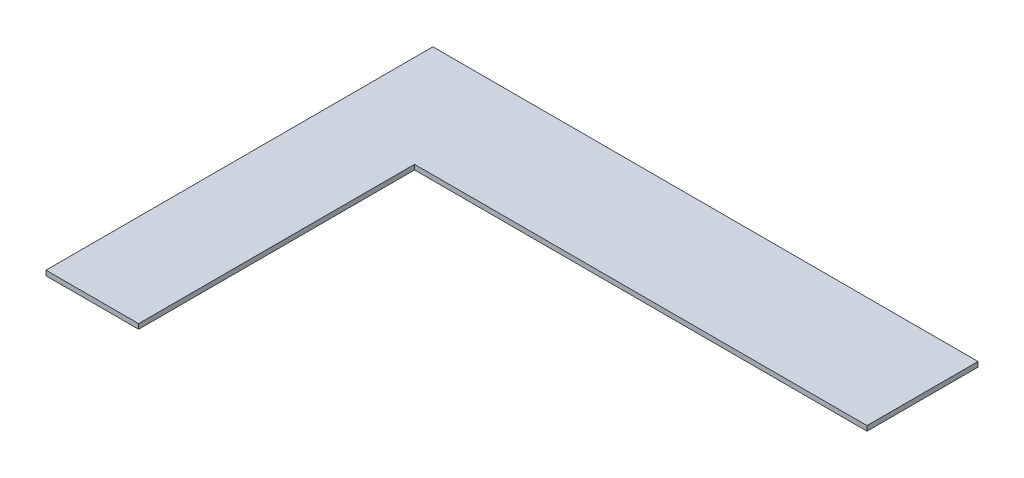
ISO-10303-21;
HEADER;
FILE_DESCRIPTION(('STEP AP214'),'2;1');
FILE_NAME('part.step','',(''),(''),'','','');
FILE_SCHEMA(('AUTOMOTIVE_DESIGN { 1 0 10303 214 1 1 1 1 }'));
ENDSEC;
DATA;
#1=APPLICATION_CONTEXT('core data for automotive mechanical design processes');
#2=APPLICATION_PROTOCOL_DEFINITION('international standard','automotive_design',2000,#1);
#3=PRODUCT_CONTEXT('',#1,'mechanical');
#4=PRODUCT('Part','Part','',(#3));
#5=PRODUCT_RELATED_PRODUCT_CATEGORY('part','',(#4));
#6=PRODUCT_DEFINITION_FORMATION('','',#4);
#7=PRODUCT_DEFINITION_CONTEXT('part definition',#1,'design');
#8=PRODUCT_DEFINITION('design','',#6,#7);
#9=PRODUCT_DEFINITION_SHAPE('','',#8);
#10=(LENGTH_UNIT() NAMED_UNIT(*) SI_UNIT(.MILLI.,.METRE.));
#11=(NAMED_UNIT(*) PLANE_ANGLE_UNIT() SI_UNIT($,.RADIAN.));
#12=(NAMED_UNIT(*) SI_UNIT($,.STERADIAN.) SOLID_ANGLE_UNIT());
#13=UNCERTAINTY_MEASURE_WITH_UNIT(LENGTH_MEASURE(1.E-05),#10,'distance_accuracy_value','');
#14=(GEOMETRIC_REPRESENTATION_CONTEXT(3) GLOBAL_UNCERTAINTY_ASSIGNED_CONTEXT((#13)) GLOBAL_UNIT_ASSIGNED_CONTEXT((#10,
#11,#12)) REPRESENTATION_CONTEXT('',''));
#15=CARTESIAN_POINT('',(0.,0.,0.));
#16=DIRECTION('',(0.,0.,1.));
#17=DIRECTION('',(1.,0.,0.));
#18=AXIS2_PLACEMENT_3D('',#15,#16,#17);
#19=CARTESIAN_POINT('',(-8.631267976045,2.15,0.));
#20=DIRECTION('',(0.,1.,0.));
#21=DIRECTION('',(0.,0.,1.));
#22=AXIS2_PLACEMENT_3D('',#19,#20,#21);
#23=PLANE('',#22);
#24=DIRECTION('',(-1.,0.,0.));
#25=VECTOR('',#24,1.);
#26=CARTESIAN_POINT('',(-8.631267976045,2.15,3.02146181909));
#27=LINE('',#26,#25);
#28=CARTESIAN_POINT('',(-1.204367370936,2.15,3.02146181909));
#29=VERTEX_POINT('',#28);
#30=CARTESIAN_POINT('',(-2.319545515188,2.15,3.02146181909));
#31=VERTEX_POINT('',#30);
#32=EDGE_CURVE('E103',#29,#31,#27,.T.);
#33=ORIENTED_EDGE('',*,*,#32,.F.);
#34=DIRECTION('',(0.,0.,-1.));
#35=VECTOR('',#34,1.);
#36=CARTESIAN_POINT('',(-1.204367370936,2.15,0.));
#37=LINE('',#36,#35);
#38=CARTESIAN_POINT('',(-1.204367370936,2.15,3.24849376134));
#39=VERTEX_POINT('',#38);
#40=EDGE_CURVE('E98',#39,#29,#37,.T.);
#41=ORIENTED_EDGE('',*,*,#40,.F.);
#42=DIRECTION('',(1.,0.,0.));
#43=VECTOR('',#42,1.);
#44=CARTESIAN_POINT('',(-8.631267976045,2.15,3.24849376134));
#45=LINE('',#44,#43);
#46=CARTESIAN_POINT('',(-2.130065138501,2.15,3.24849376134));
#47=VERTEX_POINT('',#46);
#48=EDGE_CURVE('E92',#47,#39,#45,.T.);
#49=ORIENTED_EDGE('',*,*,#48,.F.);
#50=DIRECTION('',(0.,0.,-1.));
#51=VECTOR('',#50,1.);
#52=CARTESIAN_POINT('',(-2.130065138501,2.15,0.));
#53=LINE('',#52,#51);
#54=CARTESIAN_POINT('',(-2.130065138501,2.15,3.812973028982));
#55=VERTEX_POINT('',#54);
#56=EDGE_CURVE('E68',#55,#47,#53,.T.);
#57=ORIENTED_EDGE('',*,*,#56,.F.);
#58=DIRECTION('',(1.,0.,0.));
#59=VECTOR('',#58,1.);
#60=CARTESIAN_POINT('',(-8.631267976045,2.15,3.812973028982));
#61=LINE('',#60,#59);
#62=CARTESIAN_POINT('',(-2.319545515188,2.15,3.812973028982));
#63=VERTEX_POINT('',#62);
#64=EDGE_CURVE('E70',#63,#55,#61,.T.);
#65=ORIENTED_EDGE('',*,*,#64,.F.);
#66=DIRECTION('',(0.,0.,1.));
#67=VECTOR('',#66,1.);
#68=CARTESIAN_POINT('',(-2.319545515188,2.15,0.));
#69=LINE('',#68,#67);
#70=EDGE_CURVE('E20',#31,#63,#69,.T.);
#71=ORIENTED_EDGE('',*,*,#70,.F.);
#72=EDGE_LOOP('',(#33,#41,#49,#57,#65,#71));
#73=FACE_BOUND('',#72,.T.);
#74=ADVANCED_FACE('F17',(#73),#23,.F.);
#75=CARTESIAN_POINT('',(-2.319545515188,2.16,0.));
#76=DIRECTION('',(-1.,0.,0.));
#77=DIRECTION('',(0.,0.,1.));
#78=AXIS2_PLACEMENT_3D('',#75,#76,#77);
#79=PLANE('',#78);
#80=DIRECTION('',(0.,0.,1.));
#81=VECTOR('',#80,1.);
#82=CARTESIAN_POINT('',(-2.319545515188,2.16,0.));
#83=LINE('',#82,#81);
#84=CARTESIAN_POINT('',(-2.319545515188,2.16,3.02146181909));
#85=VERTEX_POINT('',#84);
#86=CARTESIAN_POINT('',(-2.319545515188,2.16,3.812973028982));
#87=VERTEX_POINT('',#86);
#88=EDGE_CURVE('E107',#85,#87,#83,.T.);
#89=ORIENTED_EDGE('',*,*,#88,.F.);
#90=DIRECTION('',(0.,1.,0.));
#91=VECTOR('',#90,1.);
#92=CARTESIAN_POINT('',(-2.319545515188,2.16,3.02146181909));
#93=LINE('',#92,#91);
#94=EDGE_CURVE('E81',#31,#85,#93,.T.);
#95=ORIENTED_EDGE('',*,*,#94,.F.);
#96=ORIENTED_EDGE('',*,*,#70,.T.);
#97=DIRECTION('',(0.,1.,0.));
#98=VECTOR('',#97,1.);
#99=CARTESIAN_POINT('',(-2.319545515188,2.16,3.812973028982));
#100=LINE('',#99,#98);
#101=EDGE_CURVE('E76',#87,#63,#100,.F.);
#102=ORIENTED_EDGE('',*,*,#101,.F.);
#103=EDGE_LOOP('',(#89,#95,#96,#102));
#104=FACE_BOUND('',#103,.T.);
#105=ADVANCED_FACE('F78',(#104),#79,.T.);
#106=CARTESIAN_POINT('',(-8.631267976045,2.16,3.812973028982));
#107=DIRECTION('',(0.,0.,1.));
#108=DIRECTION('',(1.,0.,0.));
#109=AXIS2_PLACEMENT_3D('',#106,#107,#108);
#110=PLANE('',#109);
#111=DIRECTION('',(1.,0.,0.));
#112=VECTOR('',#111,1.);
#113=CARTESIAN_POINT('',(-8.631267976045,2.16,3.812973028982));
#114=LINE('',#113,#112);
#115=CARTESIAN_POINT('',(-2.130065138501,2.16,3.812973028982));
#116=VERTEX_POINT('',#115);
#117=EDGE_CURVE('E85',#87,#116,#114,.T.);
#118=ORIENTED_EDGE('',*,*,#117,.F.);
#119=ORIENTED_EDGE('',*,*,#101,.T.);
#120=ORIENTED_EDGE('',*,*,#64,.T.);
#121=DIRECTION('',(0.,1.,0.));
#122=VECTOR('',#121,1.);
#123=CARTESIAN_POINT('',(-2.130065138501,2.16,3.812973028982));
#124=LINE('',#123,#122);
#125=EDGE_CURVE('E88',#116,#55,#124,.F.);
#126=ORIENTED_EDGE('',*,*,#125,.F.);
#127=EDGE_LOOP('',(#118,#119,#120,#126));
#128=FACE_BOUND('',#127,.T.);
#129=ADVANCED_FACE('F83',(#128),#110,.T.);
#130=CARTESIAN_POINT('',(-2.130065138501,2.16,0.));
#131=DIRECTION('',(1.,0.,0.));
#132=DIRECTION('',(0.,0.,-1.));
#133=AXIS2_PLACEMENT_3D('',#130,#131,#132);
#134=PLANE('',#133);
#135=DIRECTION('',(0.,0.,1.));
#136=VECTOR('',#135,1.);
#137=CARTESIAN_POINT('',(-2.130065138501,2.16,0.));
#138=LINE('',#137,#136);
#139=CARTESIAN_POINT('',(-2.130065138501,2.16,3.24849376134));
#140=VERTEX_POINT('',#139);
#141=EDGE_CURVE('E110',#116,#140,#138,.F.);
#142=ORIENTED_EDGE('',*,*,#141,.F.);
#143=ORIENTED_EDGE('',*,*,#125,.T.);
#144=ORIENTED_EDGE('',*,*,#56,.T.);
#145=DIRECTION('',(0.,1.,0.));
#146=VECTOR('',#145,1.);
#147=CARTESIAN_POINT('',(-2.130065138501,2.16,3.24849376134));
#148=LINE('',#147,#146);
#149=EDGE_CURVE('E95',#140,#47,#148,.F.);
#150=ORIENTED_EDGE('',*,*,#149,.F.);
#151=EDGE_LOOP('',(#142,#143,#144,#150));
#152=FACE_BOUND('',#151,.T.);
#153=ADVANCED_FACE('F125',(#152),#134,.T.);
#154=CARTESIAN_POINT('',(-8.631267976045,2.16,3.24849376134));
#155=DIRECTION('',(0.,0.,1.));
#156=DIRECTION('',(1.,0.,0.));
#157=AXIS2_PLACEMENT_3D('',#154,#155,#156);
#158=PLANE('',#157);
#159=DIRECTION('',(1.,0.,0.));
#160=VECTOR('',#159,1.);
#161=CARTESIAN_POINT('',(-8.631267976045,2.16,3.24849376134));
#162=LINE('',#161,#160);
#163=CARTESIAN_POINT('',(-1.204367370936,2.16,3.24849376134));
#164=VERTEX_POINT('',#163);
#165=EDGE_CURVE('E113',#140,#164,#162,.T.);
#166=ORIENTED_EDGE('',*,*,#165,.F.);
#167=ORIENTED_EDGE('',*,*,#149,.T.);
#168=ORIENTED_EDGE('',*,*,#48,.T.);
#169=DIRECTION('',(0.,1.,0.));
#170=VECTOR('',#169,1.);
#171=CARTESIAN_POINT('',(-1.204367370936,2.16,3.24849376134));
#172=LINE('',#171,#170);
#173=EDGE_CURVE('E100',#164,#39,#172,.F.);
#174=ORIENTED_EDGE('',*,*,#173,.F.);
#175=EDGE_LOOP('',(#166,#167,#168,#174));
#176=FACE_BOUND('',#175,.T.);
#177=ADVANCED_FACE('F122',(#176),#158,.T.);
#178=CARTESIAN_POINT('',(-1.204367370936,2.16,0.));
#179=DIRECTION('',(1.,0.,0.));
#180=DIRECTION('',(0.,0.,-1.));
#181=AXIS2_PLACEMENT_3D('',#178,#179,#180);
#182=PLANE('',#181);
#183=DIRECTION('',(0.,0.,1.));
#184=VECTOR('',#183,1.);
#185=CARTESIAN_POINT('',(-1.204367370936,2.16,0.));
#186=LINE('',#185,#184);
#187=CARTESIAN_POINT('',(-1.204367370936,2.16,3.02146181909));
#188=VERTEX_POINT('',#187);
#189=EDGE_CURVE('E26',#164,#188,#186,.F.);
#190=ORIENTED_EDGE('',*,*,#189,.F.);
#191=ORIENTED_EDGE('',*,*,#173,.T.);
#192=ORIENTED_EDGE('',*,*,#40,.T.);
#193=DIRECTION('',(0.,1.,0.));
#194=VECTOR('',#193,1.);
#195=CARTESIAN_POINT('',(-1.204367370936,2.16,3.02146181909));
#196=LINE('',#195,#194);
#197=EDGE_CURVE('E35',#188,#29,#196,.F.);
#198=ORIENTED_EDGE('',*,*,#197,.F.);
#199=EDGE_LOOP('',(#190,#191,#192,#198));
#200=FACE_BOUND('',#199,.T.);
#201=ADVANCED_FACE('F120',(#200),#182,.T.);
#202=CARTESIAN_POINT('',(-8.631267976045,2.16,3.02146181909));
#203=DIRECTION('',(0.,0.,-1.));
#204=DIRECTION('',(-1.,0.,0.));
#205=AXIS2_PLACEMENT_3D('',#202,#203,#204);
#206=PLANE('',#205);
#207=DIRECTION('',(1.,0.,0.));
#208=VECTOR('',#207,1.);
#209=CARTESIAN_POINT('',(-8.631267976045,2.16,3.02146181909));
#210=LINE('',#209,#208);
#211=EDGE_CURVE('E11',#188,#85,#210,.F.);
#212=ORIENTED_EDGE('',*,*,#211,.F.);
#213=ORIENTED_EDGE('',*,*,#197,.T.);
#214=ORIENTED_EDGE('',*,*,#32,.T.);
#215=ORIENTED_EDGE('',*,*,#94,.T.);
#216=EDGE_LOOP('',(#212,#213,#214,#215));
#217=FACE_BOUND('',#216,.T.);
#218=ADVANCED_FACE('F127',(#217),#206,.T.);
#219=CARTESIAN_POINT('',(-8.631267976045,2.16,0.));
#220=DIRECTION('',(0.,1.,0.));
#221=DIRECTION('',(0.,0.,1.));
#222=AXIS2_PLACEMENT_3D('',#219,#220,#221);
#223=PLANE('',#222);
#224=ORIENTED_EDGE('',*,*,#189,.T.);
#225=ORIENTED_EDGE('',*,*,#211,.T.);
#226=ORIENTED_EDGE('',*,*,#88,.T.);
#227=ORIENTED_EDGE('',*,*,#117,.T.);
#228=ORIENTED_EDGE('',*,*,#141,.T.);
#229=ORIENTED_EDGE('',*,*,#165,.T.);
#230=EDGE_LOOP('',(#224,#225,#226,#227,#228,#229));
#231=FACE_BOUND('',#230,.T.);
#232=ADVANCED_FACE('F118',(#231),#223,.T.);
#233=CLOSED_SHELL('',(#74,#105,#129,#153,#177,#201,#218,#232));
#234=MANIFOLD_SOLID_BREP('B1',#233);
#235=ADVANCED_BREP_SHAPE_REPRESENTATION('',(#18,#234),#14);
#236=SHAPE_DEFINITION_REPRESENTATION(#9,#235);
ENDSEC;
END-ISO-10303-21;
